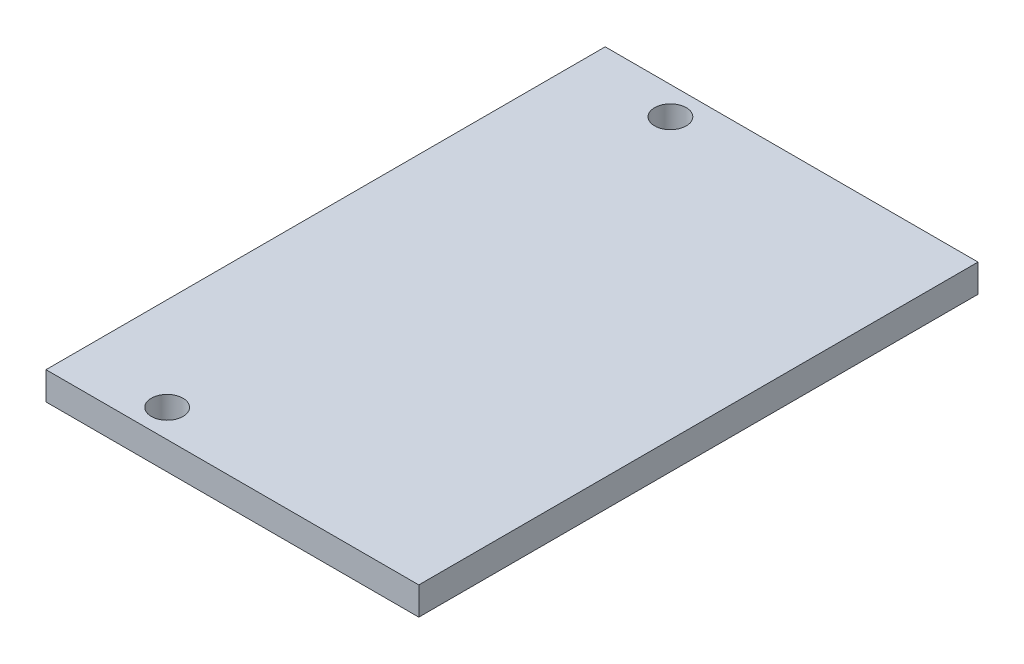
ISO-10303-21;
HEADER;
FILE_DESCRIPTION(('STEP AP214'),'2;1');
FILE_NAME('part.step','',(''),(''),'','','');
FILE_SCHEMA(('AUTOMOTIVE_DESIGN { 1 0 10303 214 1 1 1 1 }'));
ENDSEC;
DATA;
#1=APPLICATION_CONTEXT('core data for automotive mechanical design processes');
#2=APPLICATION_PROTOCOL_DEFINITION('international standard','automotive_design',2000,#1);
#3=PRODUCT_CONTEXT('',#1,'mechanical');
#4=PRODUCT('Part','Part','',(#3));
#5=PRODUCT_RELATED_PRODUCT_CATEGORY('part','',(#4));
#6=PRODUCT_DEFINITION_FORMATION('','',#4);
#7=PRODUCT_DEFINITION_CONTEXT('part definition',#1,'design');
#8=PRODUCT_DEFINITION('design','',#6,#7);
#9=PRODUCT_DEFINITION_SHAPE('','',#8);
#10=(LENGTH_UNIT() NAMED_UNIT(*) SI_UNIT(.MILLI.,.METRE.));
#11=(NAMED_UNIT(*) PLANE_ANGLE_UNIT() SI_UNIT($,.RADIAN.));
#12=(NAMED_UNIT(*) SI_UNIT($,.STERADIAN.) SOLID_ANGLE_UNIT());
#13=UNCERTAINTY_MEASURE_WITH_UNIT(LENGTH_MEASURE(1.E-05),#10,'distance_accuracy_value','');
#14=(GEOMETRIC_REPRESENTATION_CONTEXT(3) GLOBAL_UNCERTAINTY_ASSIGNED_CONTEXT((#13)) GLOBAL_UNIT_ASSIGNED_CONTEXT((#10,
#11,#12)) REPRESENTATION_CONTEXT('',''));
#15=CARTESIAN_POINT('',(0.,0.,0.));
#16=DIRECTION('',(0.,0.,1.));
#17=DIRECTION('',(1.,0.,0.));
#18=AXIS2_PLACEMENT_3D('',#15,#16,#17);
#19=CARTESIAN_POINT('',(30.,3.,0.));
#20=DIRECTION('',(1.,0.,0.));
#21=DIRECTION('',(0.,0.,-1.));
#22=AXIS2_PLACEMENT_3D('',#19,#20,#21);
#23=PLANE('',#22);
#24=DIRECTION('',(0.,0.,1.));
#25=VECTOR('',#24,1.);
#26=CARTESIAN_POINT('',(30.,0.,0.));
#27=LINE('',#26,#25);
#28=CARTESIAN_POINT('',(30.,0.,-30.));
#29=VERTEX_POINT('',#28);
#30=CARTESIAN_POINT('',(30.,0.,30.));
#31=VERTEX_POINT('',#30);
#32=EDGE_CURVE('E105',#29,#31,#27,.T.);
#33=ORIENTED_EDGE('',*,*,#32,.F.);
#34=DIRECTION('',(0.,-1.,0.));
#35=VECTOR('',#34,1.);
#36=CARTESIAN_POINT('',(30.,3.,-30.));
#37=LINE('',#36,#35);
#38=CARTESIAN_POINT('',(30.,3.,-30.));
#39=VERTEX_POINT('',#38);
#40=EDGE_CURVE('E11',#39,#29,#37,.T.);
#41=ORIENTED_EDGE('',*,*,#40,.F.);
#42=DIRECTION('',(0.,0.,1.));
#43=VECTOR('',#42,1.);
#44=CARTESIAN_POINT('',(30.,3.,0.));
#45=LINE('',#44,#43);
#46=CARTESIAN_POINT('',(30.,3.,30.));
#47=VERTEX_POINT('',#46);
#48=EDGE_CURVE('E93',#39,#47,#45,.T.);
#49=ORIENTED_EDGE('',*,*,#48,.T.);
#50=DIRECTION('',(0.,-1.,0.));
#51=VECTOR('',#50,1.);
#52=CARTESIAN_POINT('',(30.,3.,30.));
#53=LINE('',#52,#51);
#54=EDGE_CURVE('E73',#47,#31,#53,.T.);
#55=ORIENTED_EDGE('',*,*,#54,.T.);
#56=EDGE_LOOP('',(#33,#41,#49,#55));
#57=FACE_BOUND('',#56,.T.);
#58=ADVANCED_FACE('F35',(#57),#23,.T.);
#59=CARTESIAN_POINT('',(0.,3.,-30.));
#60=DIRECTION('',(0.,0.,-1.));
#61=DIRECTION('',(-1.,0.,0.));
#62=AXIS2_PLACEMENT_3D('',#59,#60,#61);
#63=PLANE('',#62);
#64=DIRECTION('',(1.,0.,0.));
#65=VECTOR('',#64,1.);
#66=CARTESIAN_POINT('',(0.,0.,-30.));
#67=LINE('',#66,#65);
#68=CARTESIAN_POINT('',(-10.,0.,-30.));
#69=VERTEX_POINT('',#68);
#70=EDGE_CURVE('E86',#69,#29,#67,.T.);
#71=ORIENTED_EDGE('',*,*,#70,.F.);
#72=DIRECTION('',(0.,-1.,0.));
#73=VECTOR('',#72,1.);
#74=CARTESIAN_POINT('',(-10.,3.,-30.));
#75=LINE('',#74,#73);
#76=CARTESIAN_POINT('',(-10.,3.,-30.));
#77=VERTEX_POINT('',#76);
#78=EDGE_CURVE('E43',#77,#69,#75,.T.);
#79=ORIENTED_EDGE('',*,*,#78,.F.);
#80=DIRECTION('',(1.,0.,0.));
#81=VECTOR('',#80,1.);
#82=CARTESIAN_POINT('',(0.,3.,-30.));
#83=LINE('',#82,#81);
#84=EDGE_CURVE('E84',#77,#39,#83,.T.);
#85=ORIENTED_EDGE('',*,*,#84,.T.);
#86=ORIENTED_EDGE('',*,*,#40,.T.);
#87=EDGE_LOOP('',(#71,#79,#85,#86));
#88=FACE_BOUND('',#87,.T.);
#89=ADVANCED_FACE('F82',(#88),#63,.T.);
#90=CARTESIAN_POINT('',(-10.,3.,0.));
#91=DIRECTION('',(1.,0.,0.));
#92=DIRECTION('',(0.,0.,-1.));
#93=AXIS2_PLACEMENT_3D('',#90,#91,#92);
#94=PLANE('',#93);
#95=DIRECTION('',(0.,0.,1.));
#96=VECTOR('',#95,1.);
#97=CARTESIAN_POINT('',(-10.,0.,0.));
#98=LINE('',#97,#96);
#99=CARTESIAN_POINT('',(-10.,0.,30.));
#100=VERTEX_POINT('',#99);
#101=EDGE_CURVE('E66',#69,#100,#98,.T.);
#102=ORIENTED_EDGE('',*,*,#101,.T.);
#103=DIRECTION('',(0.,-1.,0.));
#104=VECTOR('',#103,1.);
#105=CARTESIAN_POINT('',(-10.,3.,30.));
#106=LINE('',#105,#104);
#107=CARTESIAN_POINT('',(-10.,3.,30.));
#108=VERTEX_POINT('',#107);
#109=EDGE_CURVE('E87',#108,#100,#106,.T.);
#110=ORIENTED_EDGE('',*,*,#109,.F.);
#111=DIRECTION('',(0.,0.,1.));
#112=VECTOR('',#111,1.);
#113=CARTESIAN_POINT('',(-10.,3.,0.));
#114=LINE('',#113,#112);
#115=EDGE_CURVE('E88',#77,#108,#114,.T.);
#116=ORIENTED_EDGE('',*,*,#115,.F.);
#117=ORIENTED_EDGE('',*,*,#78,.T.);
#118=EDGE_LOOP('',(#102,#110,#116,#117));
#119=FACE_BOUND('',#118,.T.);
#120=ADVANCED_FACE('F89',(#119),#94,.F.);
#121=CARTESIAN_POINT('',(0.,3.,-27.));
#122=DIRECTION('',(0.,-1.,0.));
#123=DIRECTION('',(0.,0.,-1.));
#124=AXIS2_PLACEMENT_3D('',#121,#122,#123);
#125=CYLINDRICAL_SURFACE('',#124,1.7);
#126=CARTESIAN_POINT('',(0.,3.,-27.));
#127=DIRECTION('',(0.,1.,0.));
#128=DIRECTION('',(0.,0.,1.));
#129=AXIS2_PLACEMENT_3D('',#126,#127,#128);
#130=CIRCLE('',#129,1.7);
#131=CARTESIAN_POINT('',(0.,3.,-25.3));
#132=VERTEX_POINT('',#131);
#133=EDGE_CURVE('E99',#132,#132,#130,.T.);
#134=ORIENTED_EDGE('',*,*,#133,.T.);
#135=EDGE_LOOP('',(#134));
#136=FACE_BOUND('',#135,.T.);
#137=CARTESIAN_POINT('',(0.,0.,-27.));
#138=DIRECTION('',(0.,1.,0.));
#139=DIRECTION('',(0.,0.,1.));
#140=AXIS2_PLACEMENT_3D('',#137,#138,#139);
#141=CIRCLE('',#140,1.7);
#142=CARTESIAN_POINT('',(0.,0.,-25.3));
#143=VERTEX_POINT('',#142);
#144=EDGE_CURVE('E112',#143,#143,#141,.T.);
#145=ORIENTED_EDGE('',*,*,#144,.F.);
#146=EDGE_LOOP('',(#145));
#147=FACE_BOUND('',#146,.T.);
#148=ADVANCED_FACE('F131',(#136,#147),#125,.F.);
#149=CARTESIAN_POINT('',(0.,3.,30.));
#150=DIRECTION('',(0.,0.,-1.));
#151=DIRECTION('',(-1.,0.,0.));
#152=AXIS2_PLACEMENT_3D('',#149,#150,#151);
#153=PLANE('',#152);
#154=DIRECTION('',(1.,0.,0.));
#155=VECTOR('',#154,1.);
#156=CARTESIAN_POINT('',(0.,0.,30.));
#157=LINE('',#156,#155);
#158=EDGE_CURVE('E110',#100,#31,#157,.T.);
#159=ORIENTED_EDGE('',*,*,#158,.T.);
#160=ORIENTED_EDGE('',*,*,#54,.F.);
#161=DIRECTION('',(1.,0.,0.));
#162=VECTOR('',#161,1.);
#163=CARTESIAN_POINT('',(0.,3.,30.));
#164=LINE('',#163,#162);
#165=EDGE_CURVE('E51',#108,#47,#164,.T.);
#166=ORIENTED_EDGE('',*,*,#165,.F.);
#167=ORIENTED_EDGE('',*,*,#109,.T.);
#168=EDGE_LOOP('',(#159,#160,#166,#167));
#169=FACE_BOUND('',#168,.T.);
#170=ADVANCED_FACE('F120',(#169),#153,.F.);
#171=CARTESIAN_POINT('',(0.,3.,27.));
#172=DIRECTION('',(0.,-1.,0.));
#173=DIRECTION('',(0.,0.,-1.));
#174=AXIS2_PLACEMENT_3D('',#171,#172,#173);
#175=CYLINDRICAL_SURFACE('',#174,1.7);
#176=CARTESIAN_POINT('',(0.,3.,27.));
#177=DIRECTION('',(0.,1.,0.));
#178=DIRECTION('',(0.,0.,1.));
#179=AXIS2_PLACEMENT_3D('',#176,#177,#178);
#180=CIRCLE('',#179,1.7);
#181=CARTESIAN_POINT('',(0.,3.,28.7));
#182=VERTEX_POINT('',#181);
#183=EDGE_CURVE('E102',#182,#182,#180,.F.);
#184=ORIENTED_EDGE('',*,*,#183,.F.);
#185=EDGE_LOOP('',(#184));
#186=FACE_BOUND('',#185,.T.);
#187=CARTESIAN_POINT('',(0.,0.,27.));
#188=DIRECTION('',(0.,1.,0.));
#189=DIRECTION('',(0.,0.,1.));
#190=AXIS2_PLACEMENT_3D('',#187,#188,#189);
#191=CIRCLE('',#190,1.7);
#192=CARTESIAN_POINT('',(0.,0.,28.7));
#193=VERTEX_POINT('',#192);
#194=EDGE_CURVE('E95',#193,#193,#191,.F.);
#195=ORIENTED_EDGE('',*,*,#194,.T.);
#196=EDGE_LOOP('',(#195));
#197=FACE_BOUND('',#196,.T.);
#198=ADVANCED_FACE('F136',(#186,#197),#175,.F.);
#199=CARTESIAN_POINT('',(0.,3.,0.));
#200=DIRECTION('',(0.,1.,0.));
#201=DIRECTION('',(0.,0.,1.));
#202=AXIS2_PLACEMENT_3D('',#199,#200,#201);
#203=PLANE('',#202);
#204=ORIENTED_EDGE('',*,*,#48,.F.);
#205=ORIENTED_EDGE('',*,*,#84,.F.);
#206=ORIENTED_EDGE('',*,*,#115,.T.);
#207=ORIENTED_EDGE('',*,*,#165,.T.);
#208=EDGE_LOOP('',(#204,#205,#206,#207));
#209=FACE_BOUND('',#208,.T.);
#210=ORIENTED_EDGE('',*,*,#133,.F.);
#211=EDGE_LOOP('',(#210));
#212=FACE_BOUND('',#211,.T.);
#213=ORIENTED_EDGE('',*,*,#183,.T.);
#214=EDGE_LOOP('',(#213));
#215=FACE_BOUND('',#214,.T.);
#216=ADVANCED_FACE('F91',(#209,#212,#215),#203,.T.);
#217=CARTESIAN_POINT('',(0.,0.,0.));
#218=DIRECTION('',(0.,1.,0.));
#219=DIRECTION('',(0.,0.,1.));
#220=AXIS2_PLACEMENT_3D('',#217,#218,#219);
#221=PLANE('',#220);
#222=ORIENTED_EDGE('',*,*,#32,.T.);
#223=ORIENTED_EDGE('',*,*,#158,.F.);
#224=ORIENTED_EDGE('',*,*,#101,.F.);
#225=ORIENTED_EDGE('',*,*,#70,.T.);
#226=EDGE_LOOP('',(#222,#223,#224,#225));
#227=FACE_BOUND('',#226,.T.);
#228=ORIENTED_EDGE('',*,*,#144,.T.);
#229=EDGE_LOOP('',(#228));
#230=FACE_BOUND('',#229,.T.);
#231=ORIENTED_EDGE('',*,*,#194,.F.);
#232=EDGE_LOOP('',(#231));
#233=FACE_BOUND('',#232,.T.);
#234=ADVANCED_FACE('F122',(#227,#230,#233),#221,.F.);
#235=CLOSED_SHELL('',(#58,#89,#120,#148,#170,#198,#216,#234));
#236=MANIFOLD_SOLID_BREP('B2',#235);
#237=ADVANCED_BREP_SHAPE_REPRESENTATION('',(#18,#236),#14);
#238=SHAPE_DEFINITION_REPRESENTATION(#9,#237);
ENDSEC;
END-ISO-10303-21;
